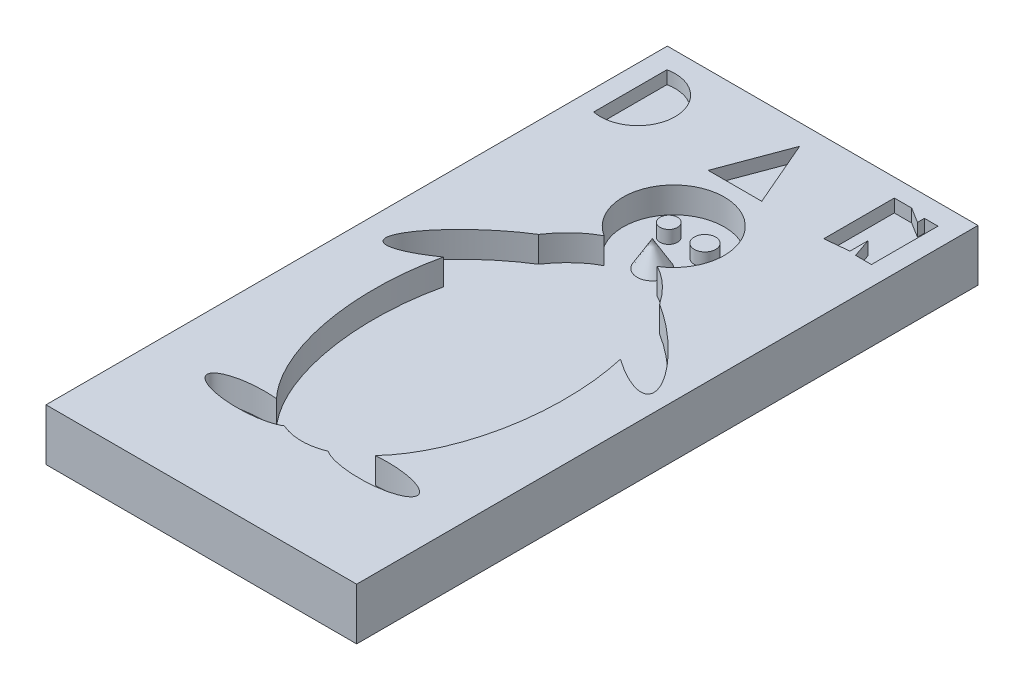
ISO-10303-21;
HEADER;
FILE_DESCRIPTION(('STEP AP214'),'2;1');
FILE_NAME('part.step','',(''),(''),'','','');
FILE_SCHEMA(('AUTOMOTIVE_DESIGN { 1 0 10303 214 1 1 1 1 }'));
ENDSEC;
DATA;
#1=APPLICATION_CONTEXT('core data for automotive mechanical design processes');
#2=APPLICATION_PROTOCOL_DEFINITION('international standard','automotive_design',2000,#1);
#3=PRODUCT_CONTEXT('',#1,'mechanical');
#4=PRODUCT('Part','Part','',(#3));
#5=PRODUCT_RELATED_PRODUCT_CATEGORY('part','',(#4));
#6=PRODUCT_DEFINITION_FORMATION('','',#4);
#7=PRODUCT_DEFINITION_CONTEXT('part definition',#1,'design');
#8=PRODUCT_DEFINITION('design','',#6,#7);
#9=PRODUCT_DEFINITION_SHAPE('','',#8);
#10=(LENGTH_UNIT() NAMED_UNIT(*) SI_UNIT(.MILLI.,.METRE.));
#11=(NAMED_UNIT(*) PLANE_ANGLE_UNIT() SI_UNIT($,.RADIAN.));
#12=(NAMED_UNIT(*) SI_UNIT($,.STERADIAN.) SOLID_ANGLE_UNIT());
#13=UNCERTAINTY_MEASURE_WITH_UNIT(LENGTH_MEASURE(1.E-05),#10,'distance_accuracy_value','');
#14=(GEOMETRIC_REPRESENTATION_CONTEXT(3) GLOBAL_UNCERTAINTY_ASSIGNED_CONTEXT((#13)) GLOBAL_UNIT_ASSIGNED_CONTEXT((#10,
#11,#12)) REPRESENTATION_CONTEXT('',''));
#15=CARTESIAN_POINT('',(0.,0.,0.));
#16=DIRECTION('',(0.,0.,1.));
#17=DIRECTION('',(1.,0.,0.));
#18=AXIS2_PLACEMENT_3D('',#15,#16,#17);
#19=CARTESIAN_POINT('',(0.,12.7,0.));
#20=DIRECTION('',(1.,0.,0.));
#21=DIRECTION('',(0.,0.,-1.));
#22=AXIS2_PLACEMENT_3D('',#19,#20,#21);
#23=PLANE('',#22);
#24=DIRECTION('',(0.,0.,1.));
#25=VECTOR('',#24,1.);
#26=CARTESIAN_POINT('',(0.,0.,0.));
#27=LINE('',#26,#25);
#28=CARTESIAN_POINT('',(0.,0.,-152.4));
#29=VERTEX_POINT('',#28);
#30=CARTESIAN_POINT('',(0.,0.,0.));
#31=VERTEX_POINT('',#30);
#32=EDGE_CURVE('E451',#29,#31,#27,.T.);
#33=ORIENTED_EDGE('',*,*,#32,.T.);
#34=DIRECTION('',(0.,-1.,0.));
#35=VECTOR('',#34,1.);
#36=CARTESIAN_POINT('',(0.,12.7,0.));
#37=LINE('',#36,#35);
#38=CARTESIAN_POINT('',(0.,12.7,0.));
#39=VERTEX_POINT('',#38);
#40=EDGE_CURVE('E454',#39,#31,#37,.T.);
#41=ORIENTED_EDGE('',*,*,#40,.F.);
#42=DIRECTION('',(0.,0.,1.));
#43=VECTOR('',#42,1.);
#44=CARTESIAN_POINT('',(0.,12.7,0.));
#45=LINE('',#44,#43);
#46=CARTESIAN_POINT('',(0.,12.7,-152.4));
#47=VERTEX_POINT('',#46);
#48=EDGE_CURVE('E645',#47,#39,#45,.T.);
#49=ORIENTED_EDGE('',*,*,#48,.F.);
#50=DIRECTION('',(0.,-1.,0.));
#51=VECTOR('',#50,1.);
#52=CARTESIAN_POINT('',(0.,12.7,-152.4));
#53=LINE('',#52,#51);
#54=EDGE_CURVE('E456',#47,#29,#53,.T.);
#55=ORIENTED_EDGE('',*,*,#54,.T.);
#56=EDGE_LOOP('',(#33,#41,#49,#55));
#57=FACE_BOUND('',#56,.T.);
#58=ADVANCED_FACE('F45',(#57),#23,.F.);
#59=CARTESIAN_POINT('',(0.,12.7,0.));
#60=DIRECTION('',(0.,0.,-1.));
#61=DIRECTION('',(-1.,0.,0.));
#62=AXIS2_PLACEMENT_3D('',#59,#60,#61);
#63=PLANE('',#62);
#64=DIRECTION('',(1.,0.,0.));
#65=VECTOR('',#64,1.);
#66=CARTESIAN_POINT('',(0.,0.,0.));
#67=LINE('',#66,#65);
#68=CARTESIAN_POINT('',(76.2,0.,0.));
#69=VERTEX_POINT('',#68);
#70=EDGE_CURVE('E459',#31,#69,#67,.T.);
#71=ORIENTED_EDGE('',*,*,#70,.T.);
#72=DIRECTION('',(0.,-1.,0.));
#73=VECTOR('',#72,1.);
#74=CARTESIAN_POINT('',(76.2,12.7,0.));
#75=LINE('',#74,#73);
#76=CARTESIAN_POINT('',(76.2,12.7,0.));
#77=VERTEX_POINT('',#76);
#78=EDGE_CURVE('E640',#77,#69,#75,.T.);
#79=ORIENTED_EDGE('',*,*,#78,.F.);
#80=DIRECTION('',(1.,0.,0.));
#81=VECTOR('',#80,1.);
#82=CARTESIAN_POINT('',(0.,12.7,0.));
#83=LINE('',#82,#81);
#84=EDGE_CURVE('E648',#39,#77,#83,.T.);
#85=ORIENTED_EDGE('',*,*,#84,.F.);
#86=ORIENTED_EDGE('',*,*,#40,.T.);
#87=EDGE_LOOP('',(#71,#79,#85,#86));
#88=FACE_BOUND('',#87,.T.);
#89=ADVANCED_FACE('F440',(#88),#63,.F.);
#90=CARTESIAN_POINT('',(76.2,12.7,0.));
#91=DIRECTION('',(-1.,0.,0.));
#92=DIRECTION('',(0.,0.,1.));
#93=AXIS2_PLACEMENT_3D('',#90,#91,#92);
#94=PLANE('',#93);
#95=DIRECTION('',(0.,0.,-1.));
#96=VECTOR('',#95,1.);
#97=CARTESIAN_POINT('',(76.2,0.,0.));
#98=LINE('',#97,#96);
#99=CARTESIAN_POINT('',(76.2,0.,-152.4));
#100=VERTEX_POINT('',#99);
#101=EDGE_CURVE('E463',#69,#100,#98,.T.);
#102=ORIENTED_EDGE('',*,*,#101,.T.);
#103=DIRECTION('',(0.,-1.,0.));
#104=VECTOR('',#103,1.);
#105=CARTESIAN_POINT('',(76.2,12.7,-152.4));
#106=LINE('',#105,#104);
#107=CARTESIAN_POINT('',(76.2,12.7,-152.4));
#108=VERTEX_POINT('',#107);
#109=EDGE_CURVE('E637',#108,#100,#106,.T.);
#110=ORIENTED_EDGE('',*,*,#109,.F.);
#111=DIRECTION('',(0.,0.,-1.));
#112=VECTOR('',#111,1.);
#113=CARTESIAN_POINT('',(76.2,12.7,0.));
#114=LINE('',#113,#112);
#115=EDGE_CURVE('E661',#77,#108,#114,.T.);
#116=ORIENTED_EDGE('',*,*,#115,.F.);
#117=ORIENTED_EDGE('',*,*,#78,.T.);
#118=EDGE_LOOP('',(#102,#110,#116,#117));
#119=FACE_BOUND('',#118,.T.);
#120=ADVANCED_FACE('F445',(#119),#94,.F.);
#121=CARTESIAN_POINT('',(0.,12.7,-152.4));
#122=DIRECTION('',(0.,0.,1.));
#123=DIRECTION('',(1.,0.,0.));
#124=AXIS2_PLACEMENT_3D('',#121,#122,#123);
#125=PLANE('',#124);
#126=DIRECTION('',(-1.,0.,0.));
#127=VECTOR('',#126,1.);
#128=CARTESIAN_POINT('',(0.,0.,-152.4));
#129=LINE('',#128,#127);
#130=EDGE_CURVE('E642',#100,#29,#129,.T.);
#131=ORIENTED_EDGE('',*,*,#130,.T.);
#132=ORIENTED_EDGE('',*,*,#54,.F.);
#133=DIRECTION('',(-1.,0.,0.));
#134=VECTOR('',#133,1.);
#135=CARTESIAN_POINT('',(0.,12.7,-152.4));
#136=LINE('',#135,#134);
#137=EDGE_CURVE('E468',#108,#47,#136,.T.);
#138=ORIENTED_EDGE('',*,*,#137,.F.);
#139=ORIENTED_EDGE('',*,*,#109,.T.);
#140=EDGE_LOOP('',(#131,#132,#138,#139));
#141=FACE_BOUND('',#140,.T.);
#142=ADVANCED_FACE('F622',(#141),#125,.F.);
#143=CARTESIAN_POINT('',(0.,12.7,0.));
#144=DIRECTION('',(0.,-1.,0.));
#145=DIRECTION('',(0.,0.,-1.));
#146=AXIS2_PLACEMENT_3D('',#143,#144,#145);
#147=PLANE('',#146);
#148=DIRECTION('',(0.,0.,-1.));
#149=VECTOR('',#148,1.);
#150=CARTESIAN_POINT('',(65.9497700628187,12.7,-131.229413086132));
#151=LINE('',#150,#149);
#152=CARTESIAN_POINT('',(65.9497700628187,12.7,-131.229413086132));
#153=VERTEX_POINT('',#152);
#154=CARTESIAN_POINT('',(65.9497700628187,12.7,-135.702678285083));
#155=VERTEX_POINT('',#154);
#156=EDGE_CURVE('E327',#153,#155,#151,.T.);
#157=ORIENTED_EDGE('',*,*,#156,.F.);
#158=DIRECTION('',(0.995174203608631,0.,-0.0981239240548751));
#159=VECTOR('',#158,1.);
#160=CARTESIAN_POINT('',(60.1133722269722,12.7,-130.653945739891));
#161=LINE('',#160,#159);
#162=CARTESIAN_POINT('',(60.1133722269722,12.7,-130.653945739891));
#163=VERTEX_POINT('',#162);
#164=EDGE_CURVE('E60',#163,#153,#161,.T.);
#165=ORIENTED_EDGE('',*,*,#164,.F.);
#166=DIRECTION('',(0.,0.,1.));
#167=VECTOR('',#166,1.);
#168=CARTESIAN_POINT('',(60.1133722269722,12.7,-147.960052905901));
#169=LINE('',#168,#167);
#170=CARTESIAN_POINT('',(60.1133722269722,12.7,-147.960052905901));
#171=VERTEX_POINT('',#170);
#172=EDGE_CURVE('E262',#171,#163,#169,.T.);
#173=ORIENTED_EDGE('',*,*,#172,.F.);
#174=DIRECTION('',(-1.,0.,0.));
#175=VECTOR('',#174,1.);
#176=CARTESIAN_POINT('',(64.3688834252405,12.7,-147.960052905901));
#177=LINE('',#176,#175);
#178=CARTESIAN_POINT('',(64.3688834252405,12.7,-147.960052905901));
#179=VERTEX_POINT('',#178);
#180=EDGE_CURVE('E266',#179,#171,#177,.T.);
#181=ORIENTED_EDGE('',*,*,#180,.F.);
#182=DIRECTION('',(-0.850478806426206,0.,-0.526009315335628));
#183=VECTOR('',#182,1.);
#184=CARTESIAN_POINT('',(66.9668400143631,12.7,-146.353252881738));
#185=LINE('',#184,#183);
#186=CARTESIAN_POINT('',(68.1167415018899,12.7,-145.642054801801));
#187=VERTEX_POINT('',#186);
#188=EDGE_CURVE('E356',#187,#179,#185,.T.);
#189=ORIENTED_EDGE('',*,*,#188,.F.);
#190=DIRECTION('',(0.,0.,1.));
#191=VECTOR('',#190,1.);
#192=CARTESIAN_POINT('',(68.1167415018899,12.7,-147.337843697603));
#193=LINE('',#192,#191);
#194=CARTESIAN_POINT('',(68.1167415018899,12.7,-147.337843697603));
#195=VERTEX_POINT('',#194);
#196=EDGE_CURVE('E353',#195,#187,#193,.T.);
#197=ORIENTED_EDGE('',*,*,#196,.F.);
#198=DIRECTION('',(-1.,0.,0.));
#199=VECTOR('',#198,1.);
#200=CARTESIAN_POINT('',(71.4413893375623,12.7,-147.337843697603));
#201=LINE('',#200,#199);
#202=CARTESIAN_POINT('',(71.4413893375623,12.7,-147.337843697603));
#203=VERTEX_POINT('',#202);
#204=EDGE_CURVE('E348',#203,#195,#201,.T.);
#205=ORIENTED_EDGE('',*,*,#204,.F.);
#206=DIRECTION('',(0.,0.,-1.));
#207=VECTOR('',#206,1.);
#208=CARTESIAN_POINT('',(71.4413893375623,12.7,-131.0087177459));
#209=LINE('',#208,#207);
#210=CARTESIAN_POINT('',(71.4413893375623,12.7,-131.0087177459));
#211=VERTEX_POINT('',#210);
#212=EDGE_CURVE('E343',#211,#203,#209,.T.);
#213=ORIENTED_EDGE('',*,*,#212,.F.);
#214=DIRECTION('',(0.999984768563022,0.,0.00551929723421201));
#215=VECTOR('',#214,1.);
#216=CARTESIAN_POINT('',(67.5417907581265,12.7,-131.030241117386));
#217=LINE('',#216,#215);
#218=CARTESIAN_POINT('',(67.5417907581265,12.7,-131.030241117386));
#219=VERTEX_POINT('',#218);
#220=EDGE_CURVE('E339',#219,#211,#217,.T.);
#221=ORIENTED_EDGE('',*,*,#220,.F.);
#222=DIRECTION('',(0.322518637021301,0.,0.946563113993949));
#223=VECTOR('',#222,1.);
#224=CARTESIAN_POINT('',(65.9497700628187,12.7,-135.702678285083));
#225=LINE('',#224,#223);
#226=EDGE_CURVE('E331',#155,#219,#225,.T.);
#227=ORIENTED_EDGE('',*,*,#226,.F.);
#228=EDGE_LOOP('',(#157,#165,#173,#181,#189,#197,#205,#213,#221,#227));
#229=FACE_BOUND('',#228,.T.);
#230=DIRECTION('',(1.,0.,0.));
#231=VECTOR('',#230,1.);
#232=CARTESIAN_POINT('',(44.550696836223,12.7,-131.0087177459));
#233=LINE('',#232,#231);
#234=CARTESIAN_POINT('',(31.415995895903,12.7,-131.0087177459));
#235=VERTEX_POINT('',#234);
#236=CARTESIAN_POINT('',(44.550696836223,12.7,-131.0087177459));
#237=VERTEX_POINT('',#236);
#238=EDGE_CURVE('E286',#235,#237,#233,.T.);
#239=ORIENTED_EDGE('',*,*,#238,.F.);
#240=DIRECTION('',(-0.349907294155298,0.,0.936784332435656));
#241=VECTOR('',#240,1.);
#242=CARTESIAN_POINT('',(31.415995895903,12.7,-131.0087177459));
#243=LINE('',#242,#241);
#244=CARTESIAN_POINT('',(37.5152442285751,12.7,-147.337843697603));
#245=VERTEX_POINT('',#244);
#246=EDGE_CURVE('E68',#245,#235,#243,.T.);
#247=ORIENTED_EDGE('',*,*,#246,.F.);
#248=DIRECTION('',(-0.39568877206628,0.,-0.918384666499109));
#249=VECTOR('',#248,1.);
#250=CARTESIAN_POINT('',(37.5152442285751,12.7,-147.337843697603));
#251=LINE('',#250,#249);
#252=EDGE_CURVE('E681',#237,#245,#251,.T.);
#253=ORIENTED_EDGE('',*,*,#252,.F.);
#254=EDGE_LOOP('',(#239,#247,#253));
#255=FACE_BOUND('',#254,.T.);
#256=DIRECTION('',(0.,0.,1.));
#257=VECTOR('',#256,1.);
#258=CARTESIAN_POINT('',(4.97514907709816,12.7,-147.330196680866));
#259=LINE('',#258,#257);
#260=CARTESIAN_POINT('',(4.97514907709816,12.7,-147.330196680866));
#261=VERTEX_POINT('',#260);
#262=CARTESIAN_POINT('',(4.97514907709816,12.7,-129.360621000327));
#263=VERTEX_POINT('',#262);
#264=EDGE_CURVE('E739',#261,#263,#259,.T.);
#265=ORIENTED_EDGE('',*,*,#264,.F.);
#266=CARTESIAN_POINT('',(6.79736608333222,12.7,-138.345408840596));
#267=DIRECTION('',(0.,1.,0.));
#268=DIRECTION('',(0.,0.,1.));
#269=AXIS2_PLACEMENT_3D('',#266,#267,#268);
#270=CIRCLE('',#269,9.16770894784867);
#271=EDGE_CURVE('E725',#263,#261,#270,.T.);
#272=ORIENTED_EDGE('',*,*,#271,.F.);
#273=EDGE_LOOP('',(#265,#272));
#274=FACE_BOUND('',#273,.T.);
#275=CARTESIAN_POINT('',(39.0545532297307,12.7,-64.8050208200895));
#276=DIRECTION('',(0.,1.,0.));
#277=DIRECTION('',(0.,0.,-1.));
#278=AXIS2_PLACEMENT_3D('',#275,#276,#277);
#279=ELLIPSE('',#278,41.1651080321378,23.3865541284029);
#280=CARTESIAN_POINT('',(51.1704601228422,12.7,-29.5949675785346));
#281=VERTEX_POINT('',#280);
#282=CARTESIAN_POINT('',(60.7614639489399,12.7,-80.1239487168077));
#283=VERTEX_POINT('',#282);
#284=EDGE_CURVE('E818',#281,#283,#279,.T.);
#285=ORIENTED_EDGE('',*,*,#284,.F.);
#286=CARTESIAN_POINT('',(54.0887665979898,12.7,-26.2649341697113));
#287=DIRECTION('',(0.,1.,0.));
#288=DIRECTION('',(1.,0.,0.));
#289=AXIS2_PLACEMENT_3D('',#286,#287,#288);
#290=ELLIPSE('',#289,10.7387238344707,3.4602554577739);
#291=CARTESIAN_POINT('',(44.4397615741793,12.7,-24.7461462403595));
#292=VERTEX_POINT('',#291);
#293=EDGE_CURVE('E531',#292,#281,#290,.T.);
#294=ORIENTED_EDGE('',*,*,#293,.F.);
#295=CARTESIAN_POINT('',(39.0545532297307,12.7,-64.8050208200895));
#296=DIRECTION('',(0.,1.,0.));
#297=DIRECTION('',(0.,0.,-1.));
#298=AXIS2_PLACEMENT_3D('',#295,#296,#297);
#299=ELLIPSE('',#298,41.1651080321378,23.3865541284029);
#300=CARTESIAN_POINT('',(33.6693448852822,12.7,-24.7461462403595));
#301=VERTEX_POINT('',#300);
#302=EDGE_CURVE('E868',#301,#292,#299,.T.);
#303=ORIENTED_EDGE('',*,*,#302,.F.);
#304=CARTESIAN_POINT('',(24.0203398614717,12.7,-26.2649341697113));
#305=DIRECTION('',(0.,1.,0.));
#306=DIRECTION('',(-1.,0.,0.));
#307=AXIS2_PLACEMENT_3D('',#304,#305,#306);
#308=ELLIPSE('',#307,10.7387238344707,3.4602554577739);
#309=CARTESIAN_POINT('',(26.9386463366192,12.7,-29.5949675785347));
#310=VERTEX_POINT('',#309);
#311=EDGE_CURVE('E864',#310,#301,#308,.T.);
#312=ORIENTED_EDGE('',*,*,#311,.F.);
#313=CARTESIAN_POINT('',(39.0545532297307,12.7,-64.8050208200895));
#314=DIRECTION('',(0.,1.,0.));
#315=DIRECTION('',(0.,0.,-1.));
#316=AXIS2_PLACEMENT_3D('',#313,#314,#315);
#317=ELLIPSE('',#316,41.1651080321378,23.3865541284029);
#318=CARTESIAN_POINT('',(17.3476425105216,12.7,-80.1239487168077));
#319=VERTEX_POINT('',#318);
#320=EDGE_CURVE('E859',#319,#310,#317,.T.);
#321=ORIENTED_EDGE('',*,*,#320,.F.);
#322=CARTESIAN_POINT('',(19.5674423961929,12.7,-87.5643592216893));
#323=DIRECTION('',(0.,1.,0.));
#324=DIRECTION('',(-0.753154463756515,0.,0.657843715272584));
#325=AXIS2_PLACEMENT_3D('',#322,#323,#324);
#326=ELLIPSE('',#325,17.3479068671643,4.47658007025889);
#327=CARTESIAN_POINT('',(24.1993099438547,12.7,-96.5986463652632));
#328=VERTEX_POINT('',#327);
#329=EDGE_CURVE('E854',#328,#319,#326,.T.);
#330=ORIENTED_EDGE('',*,*,#329,.F.);
#331=CARTESIAN_POINT('',(39.0545532297307,12.7,-64.8050208200895));
#332=DIRECTION('',(0.,1.,0.));
#333=DIRECTION('',(0.,0.,-1.));
#334=AXIS2_PLACEMENT_3D('',#331,#332,#333);
#335=ELLIPSE('',#334,41.1651080321378,23.3865541284029);
#336=CARTESIAN_POINT('',(32.5547794778824,12.7,-104.348304437076));
#337=VERTEX_POINT('',#336);
#338=EDGE_CURVE('E850',#337,#328,#335,.T.);
#339=ORIENTED_EDGE('',*,*,#338,.F.);
#340=CARTESIAN_POINT('',(39.0545532297307,12.7,-114.919065380953));
#341=DIRECTION('',(0.,1.,0.));
#342=DIRECTION('',(0.,0.,1.));
#343=AXIS2_PLACEMENT_3D('',#340,#341,#342);
#344=CIRCLE('',#343,12.4091919864995);
#345=CARTESIAN_POINT('',(45.5543269815791,12.7,-104.348304437076));
#346=VERTEX_POINT('',#345);
#347=EDGE_CURVE('E842',#346,#337,#344,.T.);
#348=ORIENTED_EDGE('',*,*,#347,.F.);
#349=CARTESIAN_POINT('',(39.0545532297307,12.7,-64.8050208200895));
#350=DIRECTION('',(0.,1.,0.));
#351=DIRECTION('',(0.,0.,-1.));
#352=AXIS2_PLACEMENT_3D('',#349,#350,#351);
#353=ELLIPSE('',#352,41.1651080321378,23.3865541284029);
#354=CARTESIAN_POINT('',(53.9097965156068,12.7,-96.5986463652632));
#355=VERTEX_POINT('',#354);
#356=EDGE_CURVE('E837',#355,#346,#353,.T.);
#357=ORIENTED_EDGE('',*,*,#356,.F.);
#358=CARTESIAN_POINT('',(58.5416640632686,12.7,-87.5643592216893));
#359=DIRECTION('',(0.,1.,0.));
#360=DIRECTION('',(0.753154463756515,0.,0.657843715272584));
#361=AXIS2_PLACEMENT_3D('',#358,#359,#360);
#362=ELLIPSE('',#361,17.3479068671643,4.47658007025889);
#363=EDGE_CURVE('E832',#283,#355,#362,.T.);
#364=ORIENTED_EDGE('',*,*,#363,.F.);
#365=EDGE_LOOP('',(#285,#294,#303,#312,#321,#330,#339,#348,#357,#364));
#366=FACE_BOUND('',#365,.T.);
#367=ORIENTED_EDGE('',*,*,#48,.T.);
#368=ORIENTED_EDGE('',*,*,#84,.T.);
#369=ORIENTED_EDGE('',*,*,#115,.T.);
#370=ORIENTED_EDGE('',*,*,#137,.T.);
#371=EDGE_LOOP('',(#367,#368,#369,#370));
#372=FACE_BOUND('',#371,.T.);
#373=ADVANCED_FACE('F375',(#229,#255,#274,#366,#372),#147,.F.);
#374=CARTESIAN_POINT('',(0.,0.,0.));
#375=DIRECTION('',(0.,-1.,0.));
#376=DIRECTION('',(0.,0.,-1.));
#377=AXIS2_PLACEMENT_3D('',#374,#375,#376);
#378=PLANE('',#377);
#379=ORIENTED_EDGE('',*,*,#32,.F.);
#380=ORIENTED_EDGE('',*,*,#130,.F.);
#381=ORIENTED_EDGE('',*,*,#101,.F.);
#382=ORIENTED_EDGE('',*,*,#70,.F.);
#383=EDGE_LOOP('',(#379,#380,#381,#382));
#384=FACE_BOUND('',#383,.T.);
#385=ADVANCED_FACE('F618',(#384),#378,.T.);
#386=CARTESIAN_POINT('',(54.0887665979898,6.35,-26.2649341697113));
#387=DIRECTION('',(0.,1.,0.));
#388=DIRECTION('',(1.,0.,0.));
#389=AXIS2_PLACEMENT_3D('',#386,#387,#388);
#390=ELLIPSE('',#389,10.7387238344707,3.4602554577739);
#391=DIRECTION('',(0.,1.,0.));
#392=VECTOR('',#391,1.);
#393=SURFACE_OF_LINEAR_EXTRUSION('',#390,#392);
#394=ORIENTED_EDGE('',*,*,#293,.T.);
#395=DIRECTION('',(0.,1.,0.));
#396=VECTOR('',#395,1.);
#397=CARTESIAN_POINT('',(51.1704601228422,6.35,-29.5949675785346));
#398=LINE('',#397,#396);
#399=CARTESIAN_POINT('',(51.1704601228422,6.35,-29.5949675785346));
#400=VERTEX_POINT('',#399);
#401=EDGE_CURVE('E514',#400,#281,#398,.T.);
#402=ORIENTED_EDGE('',*,*,#401,.F.);
#403=CARTESIAN_POINT('',(44.4397615741793,6.35,-24.7461462403595));
#404=VERTEX_POINT('',#403);
#405=EDGE_CURVE('E608',#404,#400,#390,.T.);
#406=ORIENTED_EDGE('',*,*,#405,.F.);
#407=DIRECTION('',(0.,1.,0.));
#408=VECTOR('',#407,1.);
#409=CARTESIAN_POINT('',(44.4397615741793,6.35,-24.7461462403595));
#410=LINE('',#409,#408);
#411=EDGE_CURVE('E460',#404,#292,#410,.T.);
#412=ORIENTED_EDGE('',*,*,#411,.T.);
#413=EDGE_LOOP('',(#394,#402,#406,#412));
#414=FACE_BOUND('',#413,.T.);
#415=ADVANCED_FACE('F541',(#414),#393,.F.);
#416=CARTESIAN_POINT('',(39.0545532297307,6.35,-64.8050208200895));
#417=DIRECTION('',(0.,1.,0.));
#418=DIRECTION('',(0.,0.,-1.));
#419=AXIS2_PLACEMENT_3D('',#416,#417,#418);
#420=ELLIPSE('',#419,41.1651080321378,23.3865541284029);
#421=DIRECTION('',(0.,1.,0.));
#422=VECTOR('',#421,1.);
#423=SURFACE_OF_LINEAR_EXTRUSION('',#420,#422);
#424=ORIENTED_EDGE('',*,*,#302,.T.);
#425=ORIENTED_EDGE('',*,*,#411,.F.);
#426=CARTESIAN_POINT('',(33.6693448852822,6.35,-24.7461462403595));
#427=VERTEX_POINT('',#426);
#428=EDGE_CURVE('E523',#427,#404,#420,.T.);
#429=ORIENTED_EDGE('',*,*,#428,.F.);
#430=DIRECTION('',(0.,1.,0.));
#431=VECTOR('',#430,1.);
#432=CARTESIAN_POINT('',(33.6693448852822,6.35,-24.7461462403595));
#433=LINE('',#432,#431);
#434=EDGE_CURVE('E465',#427,#301,#433,.T.);
#435=ORIENTED_EDGE('',*,*,#434,.T.);
#436=EDGE_LOOP('',(#424,#425,#429,#435));
#437=FACE_BOUND('',#436,.T.);
#438=ADVANCED_FACE('F536',(#437),#423,.F.);
#439=CARTESIAN_POINT('',(24.0203398614717,6.35,-26.2649341697113));
#440=DIRECTION('',(0.,1.,0.));
#441=DIRECTION('',(-1.,0.,0.));
#442=AXIS2_PLACEMENT_3D('',#439,#440,#441);
#443=ELLIPSE('',#442,10.7387238344707,3.4602554577739);
#444=DIRECTION('',(0.,1.,0.));
#445=VECTOR('',#444,1.);
#446=SURFACE_OF_LINEAR_EXTRUSION('',#443,#445);
#447=ORIENTED_EDGE('',*,*,#311,.T.);
#448=ORIENTED_EDGE('',*,*,#434,.F.);
#449=CARTESIAN_POINT('',(26.9386463366192,6.35,-29.5949675785347));
#450=VERTEX_POINT('',#449);
#451=EDGE_CURVE('E528',#450,#427,#443,.T.);
#452=ORIENTED_EDGE('',*,*,#451,.F.);
#453=DIRECTION('',(0.,1.,0.));
#454=VECTOR('',#453,1.);
#455=CARTESIAN_POINT('',(26.9386463366192,6.35,-29.5949675785347));
#456=LINE('',#455,#454);
#457=EDGE_CURVE('E483',#450,#310,#456,.T.);
#458=ORIENTED_EDGE('',*,*,#457,.T.);
#459=EDGE_LOOP('',(#447,#448,#452,#458));
#460=FACE_BOUND('',#459,.T.);
#461=ADVANCED_FACE('F540',(#460),#446,.F.);
#462=CARTESIAN_POINT('',(39.0545532297307,6.35,-64.8050208200895));
#463=DIRECTION('',(0.,1.,0.));
#464=DIRECTION('',(0.,0.,-1.));
#465=AXIS2_PLACEMENT_3D('',#462,#463,#464);
#466=ELLIPSE('',#465,41.1651080321378,23.3865541284029);
#467=DIRECTION('',(0.,1.,0.));
#468=VECTOR('',#467,1.);
#469=SURFACE_OF_LINEAR_EXTRUSION('',#466,#468);
#470=ORIENTED_EDGE('',*,*,#320,.T.);
#471=ORIENTED_EDGE('',*,*,#457,.F.);
#472=CARTESIAN_POINT('',(17.3476425105216,6.35,-80.1239487168077));
#473=VERTEX_POINT('',#472);
#474=EDGE_CURVE('E555',#473,#450,#466,.T.);
#475=ORIENTED_EDGE('',*,*,#474,.F.);
#476=DIRECTION('',(0.,1.,0.));
#477=VECTOR('',#476,1.);
#478=CARTESIAN_POINT('',(17.3476425105216,6.35,-80.1239487168077));
#479=LINE('',#478,#477);
#480=EDGE_CURVE('E487',#473,#319,#479,.T.);
#481=ORIENTED_EDGE('',*,*,#480,.T.);
#482=EDGE_LOOP('',(#470,#471,#475,#481));
#483=FACE_BOUND('',#482,.T.);
#484=ADVANCED_FACE('F547',(#483),#469,.F.);
#485=CARTESIAN_POINT('',(19.5674423961929,6.35,-87.5643592216893));
#486=DIRECTION('',(0.,1.,0.));
#487=DIRECTION('',(-0.753154463756515,0.,0.657843715272584));
#488=AXIS2_PLACEMENT_3D('',#485,#486,#487);
#489=ELLIPSE('',#488,17.3479068671643,4.47658007025889);
#490=DIRECTION('',(0.,1.,0.));
#491=VECTOR('',#490,1.);
#492=SURFACE_OF_LINEAR_EXTRUSION('',#489,#491);
#493=ORIENTED_EDGE('',*,*,#329,.T.);
#494=ORIENTED_EDGE('',*,*,#480,.F.);
#495=CARTESIAN_POINT('',(24.1993099438547,6.35,-96.5986463652632));
#496=VERTEX_POINT('',#495);
#497=EDGE_CURVE('E559',#496,#473,#489,.T.);
#498=ORIENTED_EDGE('',*,*,#497,.F.);
#499=DIRECTION('',(0.,1.,0.));
#500=VECTOR('',#499,1.);
#501=CARTESIAN_POINT('',(24.1993099438547,6.35,-96.5986463652632));
#502=LINE('',#501,#500);
#503=EDGE_CURVE('E491',#496,#328,#502,.T.);
#504=ORIENTED_EDGE('',*,*,#503,.T.);
#505=EDGE_LOOP('',(#493,#494,#498,#504));
#506=FACE_BOUND('',#505,.T.);
#507=ADVANCED_FACE('F551',(#506),#492,.F.);
#508=CARTESIAN_POINT('',(39.0545532297307,6.35,-64.8050208200895));
#509=DIRECTION('',(0.,1.,0.));
#510=DIRECTION('',(0.,0.,-1.));
#511=AXIS2_PLACEMENT_3D('',#508,#509,#510);
#512=ELLIPSE('',#511,41.1651080321378,23.3865541284029);
#513=DIRECTION('',(0.,1.,0.));
#514=VECTOR('',#513,1.);
#515=SURFACE_OF_LINEAR_EXTRUSION('',#512,#514);
#516=ORIENTED_EDGE('',*,*,#338,.T.);
#517=ORIENTED_EDGE('',*,*,#503,.F.);
#518=CARTESIAN_POINT('',(32.5547794778824,6.35,-104.348304437076));
#519=VERTEX_POINT('',#518);
#520=EDGE_CURVE('E568',#519,#496,#512,.T.);
#521=ORIENTED_EDGE('',*,*,#520,.F.);
#522=DIRECTION('',(0.,1.,0.));
#523=VECTOR('',#522,1.);
#524=CARTESIAN_POINT('',(32.5547794778824,6.35,-104.348304437076));
#525=LINE('',#524,#523);
#526=EDGE_CURVE('E495',#519,#337,#525,.T.);
#527=ORIENTED_EDGE('',*,*,#526,.T.);
#528=EDGE_LOOP('',(#516,#517,#521,#527));
#529=FACE_BOUND('',#528,.T.);
#530=ADVANCED_FACE('F576',(#529),#515,.F.);
#531=CARTESIAN_POINT('',(39.0545532297307,6.35,-114.919065380953));
#532=DIRECTION('',(0.,1.,0.));
#533=DIRECTION('',(0.,0.,1.));
#534=AXIS2_PLACEMENT_3D('',#531,#532,#533);
#535=CYLINDRICAL_SURFACE('',#534,12.4091919864995);
#536=ORIENTED_EDGE('',*,*,#347,.T.);
#537=ORIENTED_EDGE('',*,*,#526,.F.);
#538=CARTESIAN_POINT('',(39.0545532297307,6.35,-114.919065380953));
#539=DIRECTION('',(0.,1.,0.));
#540=DIRECTION('',(0.,0.,1.));
#541=AXIS2_PLACEMENT_3D('',#538,#539,#540);
#542=CIRCLE('',#541,12.4091919864995);
#543=CARTESIAN_POINT('',(45.5543269815791,6.35,-104.348304437076));
#544=VERTEX_POINT('',#543);
#545=EDGE_CURVE('E572',#544,#519,#542,.T.);
#546=ORIENTED_EDGE('',*,*,#545,.F.);
#547=DIRECTION('',(0.,1.,0.));
#548=VECTOR('',#547,1.);
#549=CARTESIAN_POINT('',(45.5543269815791,6.35,-104.348304437076));
#550=LINE('',#549,#548);
#551=EDGE_CURVE('E503',#544,#346,#550,.T.);
#552=ORIENTED_EDGE('',*,*,#551,.T.);
#553=EDGE_LOOP('',(#536,#537,#546,#552));
#554=FACE_BOUND('',#553,.T.);
#555=ADVANCED_FACE('F579',(#554),#535,.F.);
#556=CARTESIAN_POINT('',(39.0545532297307,6.35,-64.8050208200895));
#557=DIRECTION('',(0.,1.,0.));
#558=DIRECTION('',(0.,0.,-1.));
#559=AXIS2_PLACEMENT_3D('',#556,#557,#558);
#560=ELLIPSE('',#559,41.1651080321378,23.3865541284029);
#561=DIRECTION('',(0.,1.,0.));
#562=VECTOR('',#561,1.);
#563=SURFACE_OF_LINEAR_EXTRUSION('',#560,#562);
#564=ORIENTED_EDGE('',*,*,#356,.T.);
#565=ORIENTED_EDGE('',*,*,#551,.F.);
#566=CARTESIAN_POINT('',(53.9097965156068,6.35,-96.5986463652632));
#567=VERTEX_POINT('',#566);
#568=EDGE_CURVE('E591',#567,#544,#560,.T.);
#569=ORIENTED_EDGE('',*,*,#568,.F.);
#570=DIRECTION('',(0.,1.,0.));
#571=VECTOR('',#570,1.);
#572=CARTESIAN_POINT('',(53.9097965156068,6.35,-96.5986463652632));
#573=LINE('',#572,#571);
#574=EDGE_CURVE('E506',#567,#355,#573,.T.);
#575=ORIENTED_EDGE('',*,*,#574,.T.);
#576=EDGE_LOOP('',(#564,#565,#569,#575));
#577=FACE_BOUND('',#576,.T.);
#578=ADVANCED_FACE('F583',(#577),#563,.F.);
#579=CARTESIAN_POINT('',(58.5416640632686,6.35,-87.5643592216893));
#580=DIRECTION('',(0.,1.,0.));
#581=DIRECTION('',(0.753154463756515,0.,0.657843715272584));
#582=AXIS2_PLACEMENT_3D('',#579,#580,#581);
#583=ELLIPSE('',#582,17.3479068671643,4.47658007025889);
#584=DIRECTION('',(0.,1.,0.));
#585=VECTOR('',#584,1.);
#586=SURFACE_OF_LINEAR_EXTRUSION('',#583,#585);
#587=ORIENTED_EDGE('',*,*,#363,.T.);
#588=ORIENTED_EDGE('',*,*,#574,.F.);
#589=CARTESIAN_POINT('',(60.7614639489399,6.35,-80.1239487168077));
#590=VERTEX_POINT('',#589);
#591=EDGE_CURVE('E595',#590,#567,#583,.T.);
#592=ORIENTED_EDGE('',*,*,#591,.F.);
#593=DIRECTION('',(0.,1.,0.));
#594=VECTOR('',#593,1.);
#595=CARTESIAN_POINT('',(60.7614639489399,6.35,-80.1239487168077));
#596=LINE('',#595,#594);
#597=EDGE_CURVE('E510',#590,#283,#596,.T.);
#598=ORIENTED_EDGE('',*,*,#597,.T.);
#599=EDGE_LOOP('',(#587,#588,#592,#598));
#600=FACE_BOUND('',#599,.T.);
#601=ADVANCED_FACE('F587',(#600),#586,.F.);
#602=CARTESIAN_POINT('',(39.0545532297307,6.35,-64.8050208200895));
#603=DIRECTION('',(0.,1.,0.));
#604=DIRECTION('',(0.,0.,-1.));
#605=AXIS2_PLACEMENT_3D('',#602,#603,#604);
#606=ELLIPSE('',#605,41.1651080321378,23.3865541284029);
#607=DIRECTION('',(0.,1.,0.));
#608=VECTOR('',#607,1.);
#609=SURFACE_OF_LINEAR_EXTRUSION('',#606,#608);
#610=ORIENTED_EDGE('',*,*,#284,.T.);
#611=ORIENTED_EDGE('',*,*,#597,.F.);
#612=EDGE_CURVE('E604',#400,#590,#606,.T.);
#613=ORIENTED_EDGE('',*,*,#612,.F.);
#614=ORIENTED_EDGE('',*,*,#401,.T.);
#615=EDGE_LOOP('',(#610,#611,#613,#614));
#616=FACE_BOUND('',#615,.T.);
#617=ADVANCED_FACE('F612',(#616),#609,.F.);
#618=CARTESIAN_POINT('',(54.0887665979898,6.35,-26.2649341697113));
#619=DIRECTION('',(0.,-1.,0.));
#620=DIRECTION('',(0.,0.,-1.));
#621=AXIS2_PLACEMENT_3D('',#618,#619,#620);
#622=PLANE('',#621);
#623=CARTESIAN_POINT('',(43.3131818208311,6.35,-118.313867451034));
#624=DIRECTION('',(0.,-1.,0.));
#625=DIRECTION('',(0.,0.,-1.));
#626=AXIS2_PLACEMENT_3D('',#623,#624,#625);
#627=CIRCLE('',#626,2.6250213817595);
#628=CARTESIAN_POINT('',(43.3131818208311,6.35,-120.938888832794));
#629=VERTEX_POINT('',#628);
#630=EDGE_CURVE('E13',#629,#629,#627,.F.);
#631=ORIENTED_EDGE('',*,*,#630,.F.);
#632=EDGE_LOOP('',(#631));
#633=FACE_BOUND('',#632,.T.);
#634=CARTESIAN_POINT('',(34.4451334713621,6.35,-118.313867451034));
#635=DIRECTION('',(0.,-1.,0.));
#636=DIRECTION('',(0.,0.,-1.));
#637=AXIS2_PLACEMENT_3D('',#634,#635,#636);
#638=CIRCLE('',#637,2.14774476689414);
#639=CARTESIAN_POINT('',(34.4451334713621,6.35,-120.461612217929));
#640=VERTEX_POINT('',#639);
#641=EDGE_CURVE('E53',#640,#640,#638,.F.);
#642=ORIENTED_EDGE('',*,*,#641,.F.);
#643=EDGE_LOOP('',(#642));
#644=FACE_BOUND('',#643,.T.);
#645=CARTESIAN_POINT('',(39.0545532297307,6.35,-109.669022617434));
#646=DIRECTION('',(0.,1.,0.));
#647=DIRECTION('',(0.,0.,1.));
#648=AXIS2_PLACEMENT_3D('',#645,#646,#647);
#649=CIRCLE('',#648,3.74479699542312);
#650=CARTESIAN_POINT('',(39.0545532297307,6.35,-105.924225622011));
#651=VERTEX_POINT('',#650);
#652=EDGE_CURVE('E812',#651,#651,#649,.T.);
#653=ORIENTED_EDGE('',*,*,#652,.F.);
#654=EDGE_LOOP('',(#653));
#655=FACE_BOUND('',#654,.T.);
#656=ORIENTED_EDGE('',*,*,#405,.T.);
#657=ORIENTED_EDGE('',*,*,#612,.T.);
#658=ORIENTED_EDGE('',*,*,#591,.T.);
#659=ORIENTED_EDGE('',*,*,#568,.T.);
#660=ORIENTED_EDGE('',*,*,#545,.T.);
#661=ORIENTED_EDGE('',*,*,#520,.T.);
#662=ORIENTED_EDGE('',*,*,#497,.T.);
#663=ORIENTED_EDGE('',*,*,#474,.T.);
#664=ORIENTED_EDGE('',*,*,#451,.T.);
#665=ORIENTED_EDGE('',*,*,#428,.T.);
#666=EDGE_LOOP('',(#656,#657,#658,#659,#660,#661,#662,#663,#664,#665));
#667=FACE_BOUND('',#666,.T.);
#668=ADVANCED_FACE('F543',(#633,#644,#655,#667),#622,.F.);
#669=CARTESIAN_POINT('',(39.0545532297307,12.7,-109.669022617434));
#670=DIRECTION('',(0.,-1.,0.));
#671=DIRECTION('',(0.,0.,-1.));
#672=AXIS2_PLACEMENT_3D('',#669,#670,#671);
#673=CONICAL_SURFACE('',#672,0.,0.532835147803922);
#674=ORIENTED_EDGE('',*,*,#652,.T.);
#675=EDGE_LOOP('',(#674));
#676=FACE_BOUND('',#675,.T.);
#677=CARTESIAN_POINT('',(39.0545532297307,12.7,-109.669022617434));
#678=VERTEX_POINT('',#677);
#679=VERTEX_LOOP('',#678);
#680=FACE_BOUND('',#679,.T.);
#681=ADVANCED_FACE('F801',(#676,#680),#673,.T.);
#682=CARTESIAN_POINT('',(34.4451334713621,9.525,-118.313867451034));
#683=DIRECTION('',(0.,-1.,0.));
#684=DIRECTION('',(0.,0.,-1.));
#685=AXIS2_PLACEMENT_3D('',#682,#683,#684);
#686=CYLINDRICAL_SURFACE('',#685,2.14774476689414);
#687=CARTESIAN_POINT('',(34.4451334713621,9.525,-118.313867451034));
#688=DIRECTION('',(0.,1.,0.));
#689=DIRECTION('',(0.,0.,1.));
#690=AXIS2_PLACEMENT_3D('',#687,#688,#689);
#691=CIRCLE('',#690,2.14774476689414);
#692=CARTESIAN_POINT('',(34.4451334713621,9.525,-116.16612268414));
#693=VERTEX_POINT('',#692);
#694=EDGE_CURVE('E815',#693,#693,#691,.T.);
#695=ORIENTED_EDGE('',*,*,#694,.F.);
#696=EDGE_LOOP('',(#695));
#697=FACE_BOUND('',#696,.T.);
#698=ORIENTED_EDGE('',*,*,#641,.T.);
#699=EDGE_LOOP('',(#698));
#700=FACE_BOUND('',#699,.T.);
#701=ADVANCED_FACE('F798',(#697,#700),#686,.T.);
#702=CARTESIAN_POINT('',(34.4451334713621,9.525,-118.313867451034));
#703=DIRECTION('',(0.,1.,0.));
#704=DIRECTION('',(0.,0.,1.));
#705=AXIS2_PLACEMENT_3D('',#702,#703,#704);
#706=PLANE('',#705);
#707=ORIENTED_EDGE('',*,*,#694,.T.);
#708=EDGE_LOOP('',(#707));
#709=FACE_BOUND('',#708,.T.);
#710=ADVANCED_FACE('F794',(#709),#706,.T.);
#711=CARTESIAN_POINT('',(43.3131818208311,9.525,-118.313867451034));
#712=DIRECTION('',(0.,-1.,0.));
#713=DIRECTION('',(0.,0.,-1.));
#714=AXIS2_PLACEMENT_3D('',#711,#712,#713);
#715=CYLINDRICAL_SURFACE('',#714,2.6250213817595);
#716=CARTESIAN_POINT('',(43.3131818208311,9.525,-118.313867451034));
#717=DIRECTION('',(0.,1.,0.));
#718=DIRECTION('',(0.,0.,1.));
#719=AXIS2_PLACEMENT_3D('',#716,#717,#718);
#720=CIRCLE('',#719,2.6250213817595);
#721=CARTESIAN_POINT('',(43.3131818208311,9.525,-115.688846069275));
#722=VERTEX_POINT('',#721);
#723=EDGE_CURVE('E751',#722,#722,#720,.T.);
#724=ORIENTED_EDGE('',*,*,#723,.F.);
#725=EDGE_LOOP('',(#724));
#726=FACE_BOUND('',#725,.T.);
#727=ORIENTED_EDGE('',*,*,#630,.T.);
#728=EDGE_LOOP('',(#727));
#729=FACE_BOUND('',#728,.T.);
#730=ADVANCED_FACE('F787',(#726,#729),#715,.T.);
#731=CARTESIAN_POINT('',(43.3131818208311,9.525,-118.313867451034));
#732=DIRECTION('',(0.,1.,0.));
#733=DIRECTION('',(0.,0.,1.));
#734=AXIS2_PLACEMENT_3D('',#731,#732,#733);
#735=PLANE('',#734);
#736=ORIENTED_EDGE('',*,*,#723,.T.);
#737=EDGE_LOOP('',(#736));
#738=FACE_BOUND('',#737,.T.);
#739=ADVANCED_FACE('F779',(#738),#735,.T.);
#740=CARTESIAN_POINT('',(6.79736608333222,9.525,-138.345408840596));
#741=DIRECTION('',(0.,1.,0.));
#742=DIRECTION('',(0.,0.,1.));
#743=AXIS2_PLACEMENT_3D('',#740,#741,#742);
#744=CYLINDRICAL_SURFACE('',#743,9.16770894784867);
#745=ORIENTED_EDGE('',*,*,#271,.T.);
#746=DIRECTION('',(0.,1.,0.));
#747=VECTOR('',#746,1.);
#748=CARTESIAN_POINT('',(4.97514907709816,9.525,-147.330196680866));
#749=LINE('',#748,#747);
#750=CARTESIAN_POINT('',(4.97514907709816,9.525,-147.330196680866));
#751=VERTEX_POINT('',#750);
#752=EDGE_CURVE('E752',#751,#261,#749,.T.);
#753=ORIENTED_EDGE('',*,*,#752,.F.);
#754=CARTESIAN_POINT('',(6.79736608333222,9.525,-138.345408840596));
#755=DIRECTION('',(0.,1.,0.));
#756=DIRECTION('',(0.,0.,1.));
#757=AXIS2_PLACEMENT_3D('',#754,#755,#756);
#758=CIRCLE('',#757,9.16770894784867);
#759=CARTESIAN_POINT('',(4.97514907709816,9.525,-129.360621000327));
#760=VERTEX_POINT('',#759);
#761=EDGE_CURVE('E746',#760,#751,#758,.T.);
#762=ORIENTED_EDGE('',*,*,#761,.F.);
#763=DIRECTION('',(0.,1.,0.));
#764=VECTOR('',#763,1.);
#765=CARTESIAN_POINT('',(4.97514907709816,9.525,-129.360621000327));
#766=LINE('',#765,#764);
#767=EDGE_CURVE('E747',#760,#263,#766,.T.);
#768=ORIENTED_EDGE('',*,*,#767,.T.);
#769=EDGE_LOOP('',(#745,#753,#762,#768));
#770=FACE_BOUND('',#769,.T.);
#771=ADVANCED_FACE('F777',(#770),#744,.F.);
#772=CARTESIAN_POINT('',(4.97514907709816,9.525,-147.330196680866));
#773=DIRECTION('',(-1.,0.,0.));
#774=DIRECTION('',(0.,0.,1.));
#775=AXIS2_PLACEMENT_3D('',#772,#773,#774);
#776=PLANE('',#775);
#777=ORIENTED_EDGE('',*,*,#264,.T.);
#778=ORIENTED_EDGE('',*,*,#767,.F.);
#779=DIRECTION('',(0.,0.,1.));
#780=VECTOR('',#779,1.);
#781=CARTESIAN_POINT('',(4.97514907709816,9.525,-147.330196680866));
#782=LINE('',#781,#780);
#783=EDGE_CURVE('E740',#751,#760,#782,.T.);
#784=ORIENTED_EDGE('',*,*,#783,.F.);
#785=ORIENTED_EDGE('',*,*,#752,.T.);
#786=EDGE_LOOP('',(#777,#778,#784,#785));
#787=FACE_BOUND('',#786,.T.);
#788=ADVANCED_FACE('F772',(#787),#776,.F.);
#789=CARTESIAN_POINT('',(6.79736608333222,9.525,-138.345408840596));
#790=DIRECTION('',(0.,1.,0.));
#791=DIRECTION('',(0.,0.,1.));
#792=AXIS2_PLACEMENT_3D('',#789,#790,#791);
#793=PLANE('',#792);
#794=ORIENTED_EDGE('',*,*,#761,.T.);
#795=ORIENTED_EDGE('',*,*,#783,.T.);
#796=EDGE_LOOP('',(#794,#795));
#797=FACE_BOUND('',#796,.T.);
#798=ADVANCED_FACE('F785',(#797),#793,.T.);
#799=CARTESIAN_POINT('',(31.415995895903,9.525,-131.0087177459));
#800=DIRECTION('',(-0.936784332435656,0.,-0.349907294155298));
#801=DIRECTION('',(-0.349907294155298,0.,0.936784332435656));
#802=AXIS2_PLACEMENT_3D('',#799,#800,#801);
#803=PLANE('',#802);
#804=ORIENTED_EDGE('',*,*,#246,.T.);
#805=DIRECTION('',(0.,1.,0.));
#806=VECTOR('',#805,1.);
#807=CARTESIAN_POINT('',(31.415995895903,9.525,-131.0087177459));
#808=LINE('',#807,#806);
#809=CARTESIAN_POINT('',(31.415995895903,9.525,-131.0087177459));
#810=VERTEX_POINT('',#809);
#811=EDGE_CURVE('E693',#810,#235,#808,.T.);
#812=ORIENTED_EDGE('',*,*,#811,.F.);
#813=DIRECTION('',(-0.349907294155298,0.,0.936784332435656));
#814=VECTOR('',#813,1.);
#815=CARTESIAN_POINT('',(31.415995895903,9.525,-131.0087177459));
#816=LINE('',#815,#814);
#817=CARTESIAN_POINT('',(37.5152442285751,9.525,-147.337843697603));
#818=VERTEX_POINT('',#817);
#819=EDGE_CURVE('E682',#818,#810,#816,.T.);
#820=ORIENTED_EDGE('',*,*,#819,.F.);
#821=DIRECTION('',(0.,1.,0.));
#822=VECTOR('',#821,1.);
#823=CARTESIAN_POINT('',(37.5152442285751,9.525,-147.337843697603));
#824=LINE('',#823,#822);
#825=EDGE_CURVE('E720',#818,#245,#824,.T.);
#826=ORIENTED_EDGE('',*,*,#825,.T.);
#827=EDGE_LOOP('',(#804,#812,#820,#826));
#828=FACE_BOUND('',#827,.T.);
#829=ADVANCED_FACE('F974',(#828),#803,.F.);
#830=CARTESIAN_POINT('',(37.5152442285751,9.525,-147.337843697603));
#831=DIRECTION('',(0.918384666499109,0.,-0.39568877206628));
#832=DIRECTION('',(-0.39568877206628,0.,-0.918384666499109));
#833=AXIS2_PLACEMENT_3D('',#830,#831,#832);
#834=PLANE('',#833);
#835=ORIENTED_EDGE('',*,*,#252,.T.);
#836=ORIENTED_EDGE('',*,*,#825,.F.);
#837=DIRECTION('',(-0.39568877206628,0.,-0.918384666499109));
#838=VECTOR('',#837,1.);
#839=CARTESIAN_POINT('',(37.5152442285751,9.525,-147.337843697603));
#840=LINE('',#839,#838);
#841=CARTESIAN_POINT('',(44.550696836223,9.525,-131.0087177459));
#842=VERTEX_POINT('',#841);
#843=EDGE_CURVE('E699',#842,#818,#840,.T.);
#844=ORIENTED_EDGE('',*,*,#843,.F.);
#845=DIRECTION('',(0.,1.,0.));
#846=VECTOR('',#845,1.);
#847=CARTESIAN_POINT('',(44.550696836223,9.525,-131.0087177459));
#848=LINE('',#847,#846);
#849=EDGE_CURVE('E714',#842,#237,#848,.T.);
#850=ORIENTED_EDGE('',*,*,#849,.T.);
#851=EDGE_LOOP('',(#835,#836,#844,#850));
#852=FACE_BOUND('',#851,.T.);
#853=ADVANCED_FACE('F722',(#852),#834,.F.);
#854=CARTESIAN_POINT('',(44.550696836223,9.525,-131.0087177459));
#855=DIRECTION('',(0.,0.,1.));
#856=DIRECTION('',(1.,0.,0.));
#857=AXIS2_PLACEMENT_3D('',#854,#855,#856);
#858=PLANE('',#857);
#859=ORIENTED_EDGE('',*,*,#238,.T.);
#860=ORIENTED_EDGE('',*,*,#849,.F.);
#861=DIRECTION('',(1.,0.,0.));
#862=VECTOR('',#861,1.);
#863=CARTESIAN_POINT('',(33.9021666311763,9.525,-131.0087177459));
#864=LINE('',#863,#862);
#865=EDGE_CURVE('E692',#810,#842,#864,.T.);
#866=ORIENTED_EDGE('',*,*,#865,.F.);
#867=ORIENTED_EDGE('',*,*,#811,.T.);
#868=EDGE_LOOP('',(#859,#860,#866,#867));
#869=FACE_BOUND('',#868,.T.);
#870=ADVANCED_FACE('F715',(#869),#858,.F.);
#871=CARTESIAN_POINT('',(0.,9.525,0.));
#872=DIRECTION('',(0.,-1.,0.));
#873=DIRECTION('',(0.,0.,-1.));
#874=AXIS2_PLACEMENT_3D('',#871,#872,#873);
#875=PLANE('',#874);
#876=ORIENTED_EDGE('',*,*,#865,.T.);
#877=ORIENTED_EDGE('',*,*,#843,.T.);
#878=ORIENTED_EDGE('',*,*,#819,.T.);
#879=EDGE_LOOP('',(#876,#877,#878));
#880=FACE_BOUND('',#879,.T.);
#881=ADVANCED_FACE('F710',(#880),#875,.F.);
#882=CARTESIAN_POINT('',(60.1133722269722,9.525,-130.653945739891));
#883=DIRECTION('',(0.0981239240548751,0.,0.995174203608631));
#884=DIRECTION('',(0.995174203608631,0.,-0.0981239240548751));
#885=AXIS2_PLACEMENT_3D('',#882,#883,#884);
#886=PLANE('',#885);
#887=ORIENTED_EDGE('',*,*,#164,.T.);
#888=DIRECTION('',(0.,1.,0.));
#889=VECTOR('',#888,1.);
#890=CARTESIAN_POINT('',(65.9497700628187,9.525,-131.229413086132));
#891=LINE('',#890,#889);
#892=CARTESIAN_POINT('',(65.9497700628187,9.525,-131.229413086132));
#893=VERTEX_POINT('',#892);
#894=EDGE_CURVE('E237',#893,#153,#891,.T.);
#895=ORIENTED_EDGE('',*,*,#894,.F.);
#896=DIRECTION('',(0.995174203608631,0.,-0.0981239240548751));
#897=VECTOR('',#896,1.);
#898=CARTESIAN_POINT('',(60.1133722269722,9.525,-130.653945739891));
#899=LINE('',#898,#897);
#900=CARTESIAN_POINT('',(60.1133722269722,9.525,-130.653945739891));
#901=VERTEX_POINT('',#900);
#902=EDGE_CURVE('E241',#901,#893,#899,.T.);
#903=ORIENTED_EDGE('',*,*,#902,.F.);
#904=DIRECTION('',(0.,1.,0.));
#905=VECTOR('',#904,1.);
#906=CARTESIAN_POINT('',(60.1133722269722,9.525,-130.653945739891));
#907=LINE('',#906,#905);
#908=EDGE_CURVE('E282',#901,#163,#907,.T.);
#909=ORIENTED_EDGE('',*,*,#908,.T.);
#910=EDGE_LOOP('',(#887,#895,#903,#909));
#911=FACE_BOUND('',#910,.T.);
#912=ADVANCED_FACE('F239',(#911),#886,.F.);
#913=CARTESIAN_POINT('',(60.1133722269722,9.525,-147.960052905901));
#914=DIRECTION('',(-1.,0.,0.));
#915=DIRECTION('',(0.,0.,1.));
#916=AXIS2_PLACEMENT_3D('',#913,#914,#915);
#917=PLANE('',#916);
#918=ORIENTED_EDGE('',*,*,#172,.T.);
#919=ORIENTED_EDGE('',*,*,#908,.F.);
#920=DIRECTION('',(0.,0.,1.));
#921=VECTOR('',#920,1.);
#922=CARTESIAN_POINT('',(60.1133722269722,9.525,-147.960052905901));
#923=LINE('',#922,#921);
#924=CARTESIAN_POINT('',(60.1133722269722,9.525,-147.960052905901));
#925=VERTEX_POINT('',#924);
#926=EDGE_CURVE('E247',#925,#901,#923,.T.);
#927=ORIENTED_EDGE('',*,*,#926,.F.);
#928=DIRECTION('',(0.,1.,0.));
#929=VECTOR('',#928,1.);
#930=CARTESIAN_POINT('',(60.1133722269722,9.525,-147.960052905901));
#931=LINE('',#930,#929);
#932=EDGE_CURVE('E287',#925,#171,#931,.T.);
#933=ORIENTED_EDGE('',*,*,#932,.T.);
#934=EDGE_LOOP('',(#918,#919,#927,#933));
#935=FACE_BOUND('',#934,.T.);
#936=ADVANCED_FACE('F1009',(#935),#917,.F.);
#937=CARTESIAN_POINT('',(64.3688834252405,9.525,-147.960052905901));
#938=DIRECTION('',(0.,0.,-1.));
#939=DIRECTION('',(-1.,0.,0.));
#940=AXIS2_PLACEMENT_3D('',#937,#938,#939);
#941=PLANE('',#940);
#942=ORIENTED_EDGE('',*,*,#180,.T.);
#943=ORIENTED_EDGE('',*,*,#932,.F.);
#944=DIRECTION('',(-1.,0.,0.));
#945=VECTOR('',#944,1.);
#946=CARTESIAN_POINT('',(64.3688834252405,9.525,-147.960052905901));
#947=LINE('',#946,#945);
#948=CARTESIAN_POINT('',(64.3688834252405,9.525,-147.960052905901));
#949=VERTEX_POINT('',#948);
#950=EDGE_CURVE('E321',#949,#925,#947,.T.);
#951=ORIENTED_EDGE('',*,*,#950,.F.);
#952=DIRECTION('',(0.,1.,0.));
#953=VECTOR('',#952,1.);
#954=CARTESIAN_POINT('',(64.3688834252405,9.525,-147.960052905901));
#955=LINE('',#954,#953);
#956=EDGE_CURVE('E299',#949,#179,#955,.T.);
#957=ORIENTED_EDGE('',*,*,#956,.T.);
#958=EDGE_LOOP('',(#942,#943,#951,#957));
#959=FACE_BOUND('',#958,.T.);
#960=ADVANCED_FACE('F379',(#959),#941,.F.);
#961=CARTESIAN_POINT('',(66.9668400143631,9.525,-146.353252881738));
#962=DIRECTION('',(0.526009315335628,0.,-0.850478806426206));
#963=DIRECTION('',(-0.850478806426206,0.,-0.526009315335628));
#964=AXIS2_PLACEMENT_3D('',#961,#962,#963);
#965=PLANE('',#964);
#966=ORIENTED_EDGE('',*,*,#188,.T.);
#967=ORIENTED_EDGE('',*,*,#956,.F.);
#968=DIRECTION('',(-0.850478806426208,0.,-0.526009315335624));
#969=VECTOR('',#968,1.);
#970=CARTESIAN_POINT('',(68.1167415018899,9.525,-145.642054801801));
#971=LINE('',#970,#969);
#972=CARTESIAN_POINT('',(68.1167415018899,9.525,-145.642054801801));
#973=VERTEX_POINT('',#972);
#974=EDGE_CURVE('E382',#973,#949,#971,.T.);
#975=ORIENTED_EDGE('',*,*,#974,.F.);
#976=DIRECTION('',(0.,1.,0.));
#977=VECTOR('',#976,1.);
#978=CARTESIAN_POINT('',(68.1167415018899,9.525,-145.642054801801));
#979=LINE('',#978,#977);
#980=EDGE_CURVE('E302',#973,#187,#979,.T.);
#981=ORIENTED_EDGE('',*,*,#980,.T.);
#982=EDGE_LOOP('',(#966,#967,#975,#981));
#983=FACE_BOUND('',#982,.T.);
#984=ADVANCED_FACE('F381',(#983),#965,.F.);
#985=CARTESIAN_POINT('',(68.1167415018899,9.525,-147.337843697603));
#986=DIRECTION('',(-1.,0.,0.));
#987=DIRECTION('',(0.,0.,1.));
#988=AXIS2_PLACEMENT_3D('',#985,#986,#987);
#989=PLANE('',#988);
#990=ORIENTED_EDGE('',*,*,#196,.T.);
#991=ORIENTED_EDGE('',*,*,#980,.F.);
#992=DIRECTION('',(0.,0.,1.));
#993=VECTOR('',#992,1.);
#994=CARTESIAN_POINT('',(68.1167415018899,9.525,-147.337843697603));
#995=LINE('',#994,#993);
#996=CARTESIAN_POINT('',(68.1167415018899,9.525,-147.337843697603));
#997=VERTEX_POINT('',#996);
#998=EDGE_CURVE('E385',#997,#973,#995,.T.);
#999=ORIENTED_EDGE('',*,*,#998,.F.);
#1000=DIRECTION('',(0.,1.,0.));
#1001=VECTOR('',#1000,1.);
#1002=CARTESIAN_POINT('',(68.1167415018899,9.525,-147.337843697603));
#1003=LINE('',#1002,#1001);
#1004=EDGE_CURVE('E306',#997,#195,#1003,.T.);
#1005=ORIENTED_EDGE('',*,*,#1004,.T.);
#1006=EDGE_LOOP('',(#990,#991,#999,#1005));
#1007=FACE_BOUND('',#1006,.T.);
#1008=ADVANCED_FACE('F370',(#1007),#989,.F.);
#1009=CARTESIAN_POINT('',(71.4413893375623,9.525,-147.337843697603));
#1010=DIRECTION('',(0.,0.,-1.));
#1011=DIRECTION('',(-1.,0.,0.));
#1012=AXIS2_PLACEMENT_3D('',#1009,#1010,#1011);
#1013=PLANE('',#1012);
#1014=ORIENTED_EDGE('',*,*,#204,.T.);
#1015=ORIENTED_EDGE('',*,*,#1004,.F.);
#1016=DIRECTION('',(-1.,0.,0.));
#1017=VECTOR('',#1016,1.);
#1018=CARTESIAN_POINT('',(71.4413893375623,9.525,-147.337843697603));
#1019=LINE('',#1018,#1017);
#1020=CARTESIAN_POINT('',(71.4413893375623,9.525,-147.337843697603));
#1021=VERTEX_POINT('',#1020);
#1022=EDGE_CURVE('E389',#1021,#997,#1019,.T.);
#1023=ORIENTED_EDGE('',*,*,#1022,.F.);
#1024=DIRECTION('',(0.,1.,0.));
#1025=VECTOR('',#1024,1.);
#1026=CARTESIAN_POINT('',(71.4413893375623,9.525,-147.337843697603));
#1027=LINE('',#1026,#1025);
#1028=EDGE_CURVE('E310',#1021,#203,#1027,.T.);
#1029=ORIENTED_EDGE('',*,*,#1028,.T.);
#1030=EDGE_LOOP('',(#1014,#1015,#1023,#1029));
#1031=FACE_BOUND('',#1030,.T.);
#1032=ADVANCED_FACE('F429',(#1031),#1013,.F.);
#1033=CARTESIAN_POINT('',(71.4413893375623,9.525,-131.0087177459));
#1034=DIRECTION('',(1.,0.,0.));
#1035=DIRECTION('',(0.,0.,-1.));
#1036=AXIS2_PLACEMENT_3D('',#1033,#1034,#1035);
#1037=PLANE('',#1036);
#1038=ORIENTED_EDGE('',*,*,#212,.T.);
#1039=ORIENTED_EDGE('',*,*,#1028,.F.);
#1040=DIRECTION('',(0.,0.,-1.));
#1041=VECTOR('',#1040,1.);
#1042=CARTESIAN_POINT('',(71.4413893375623,9.525,-131.0087177459));
#1043=LINE('',#1042,#1041);
#1044=CARTESIAN_POINT('',(71.4413893375623,9.525,-131.0087177459));
#1045=VERTEX_POINT('',#1044);
#1046=EDGE_CURVE('E393',#1045,#1021,#1043,.T.);
#1047=ORIENTED_EDGE('',*,*,#1046,.F.);
#1048=DIRECTION('',(0.,1.,0.));
#1049=VECTOR('',#1048,1.);
#1050=CARTESIAN_POINT('',(71.4413893375623,9.525,-131.0087177459));
#1051=LINE('',#1050,#1049);
#1052=EDGE_CURVE('E420',#1045,#211,#1051,.T.);
#1053=ORIENTED_EDGE('',*,*,#1052,.T.);
#1054=EDGE_LOOP('',(#1038,#1039,#1047,#1053));
#1055=FACE_BOUND('',#1054,.T.);
#1056=ADVANCED_FACE('F426',(#1055),#1037,.F.);
#1057=CARTESIAN_POINT('',(67.5417907581265,9.525,-131.030241117386));
#1058=DIRECTION('',(-0.00551929723421201,0.,0.999984768563022));
#1059=DIRECTION('',(0.999984768563022,0.,0.00551929723421201));
#1060=AXIS2_PLACEMENT_3D('',#1057,#1058,#1059);
#1061=PLANE('',#1060);
#1062=ORIENTED_EDGE('',*,*,#220,.T.);
#1063=ORIENTED_EDGE('',*,*,#1052,.F.);
#1064=DIRECTION('',(0.999984768563022,0.,0.00551929723421201));
#1065=VECTOR('',#1064,1.);
#1066=CARTESIAN_POINT('',(67.5417907581265,9.525,-131.030241117386));
#1067=LINE('',#1066,#1065);
#1068=CARTESIAN_POINT('',(67.5417907581265,9.525,-131.030241117386));
#1069=VERTEX_POINT('',#1068);
#1070=EDGE_CURVE('E406',#1069,#1045,#1067,.T.);
#1071=ORIENTED_EDGE('',*,*,#1070,.F.);
#1072=DIRECTION('',(0.,1.,0.));
#1073=VECTOR('',#1072,1.);
#1074=CARTESIAN_POINT('',(67.5417907581265,9.525,-131.030241117386));
#1075=LINE('',#1074,#1073);
#1076=EDGE_CURVE('E416',#1069,#219,#1075,.T.);
#1077=ORIENTED_EDGE('',*,*,#1076,.T.);
#1078=EDGE_LOOP('',(#1062,#1063,#1071,#1077));
#1079=FACE_BOUND('',#1078,.T.);
#1080=ADVANCED_FACE('F422',(#1079),#1061,.F.);
#1081=CARTESIAN_POINT('',(65.9497700628187,9.525,-135.702678285083));
#1082=DIRECTION('',(-0.946563113993949,0.,0.322518637021301));
#1083=DIRECTION('',(0.322518637021301,0.,0.946563113993949));
#1084=AXIS2_PLACEMENT_3D('',#1081,#1082,#1083);
#1085=PLANE('',#1084);
#1086=ORIENTED_EDGE('',*,*,#226,.T.);
#1087=ORIENTED_EDGE('',*,*,#1076,.F.);
#1088=DIRECTION('',(0.322518637021301,0.,0.946563113993949));
#1089=VECTOR('',#1088,1.);
#1090=CARTESIAN_POINT('',(65.9497700628187,9.525,-135.702678285083));
#1091=LINE('',#1090,#1089);
#1092=CARTESIAN_POINT('',(65.9497700628187,9.525,-135.702678285083));
#1093=VERTEX_POINT('',#1092);
#1094=EDGE_CURVE('E256',#1093,#1069,#1091,.T.);
#1095=ORIENTED_EDGE('',*,*,#1094,.F.);
#1096=DIRECTION('',(0.,1.,0.));
#1097=VECTOR('',#1096,1.);
#1098=CARTESIAN_POINT('',(65.9497700628187,9.525,-135.702678285083));
#1099=LINE('',#1098,#1097);
#1100=EDGE_CURVE('E246',#1093,#155,#1099,.T.);
#1101=ORIENTED_EDGE('',*,*,#1100,.T.);
#1102=EDGE_LOOP('',(#1086,#1087,#1095,#1101));
#1103=FACE_BOUND('',#1102,.T.);
#1104=ADVANCED_FACE('F415',(#1103),#1085,.F.);
#1105=CARTESIAN_POINT('',(65.9497700628187,9.525,-131.229413086132));
#1106=DIRECTION('',(1.,0.,0.));
#1107=DIRECTION('',(0.,0.,-1.));
#1108=AXIS2_PLACEMENT_3D('',#1105,#1106,#1107);
#1109=PLANE('',#1108);
#1110=ORIENTED_EDGE('',*,*,#156,.T.);
#1111=ORIENTED_EDGE('',*,*,#1100,.F.);
#1112=DIRECTION('',(0.,0.,-1.));
#1113=VECTOR('',#1112,1.);
#1114=CARTESIAN_POINT('',(65.9497700628187,9.525,-131.229413086132));
#1115=LINE('',#1114,#1113);
#1116=EDGE_CURVE('E250',#893,#1093,#1115,.T.);
#1117=ORIENTED_EDGE('',*,*,#1116,.F.);
#1118=ORIENTED_EDGE('',*,*,#894,.T.);
#1119=EDGE_LOOP('',(#1110,#1111,#1117,#1118));
#1120=FACE_BOUND('',#1119,.T.);
#1121=ADVANCED_FACE('F251',(#1120),#1109,.F.);
#1122=CARTESIAN_POINT('',(0.,9.525,0.));
#1123=DIRECTION('',(0.,1.,0.));
#1124=DIRECTION('',(0.,0.,1.));
#1125=AXIS2_PLACEMENT_3D('',#1122,#1123,#1124);
#1126=PLANE('',#1125);
#1127=ORIENTED_EDGE('',*,*,#902,.T.);
#1128=ORIENTED_EDGE('',*,*,#1116,.T.);
#1129=ORIENTED_EDGE('',*,*,#1094,.T.);
#1130=ORIENTED_EDGE('',*,*,#1070,.T.);
#1131=ORIENTED_EDGE('',*,*,#1046,.T.);
#1132=ORIENTED_EDGE('',*,*,#1022,.T.);
#1133=ORIENTED_EDGE('',*,*,#998,.T.);
#1134=ORIENTED_EDGE('',*,*,#974,.T.);
#1135=ORIENTED_EDGE('',*,*,#950,.T.);
#1136=ORIENTED_EDGE('',*,*,#926,.T.);
#1137=EDGE_LOOP('',(#1127,#1128,#1129,#1130,#1131,#1132,#1133,#1134,#1135,#1136));
#1138=FACE_BOUND('',#1137,.T.);
#1139=ADVANCED_FACE('F258',(#1138),#1126,.T.);
#1140=CLOSED_SHELL('',(#58,#89,#120,#142,#373,#385,#415,#438,#461,#484,#507,#530,#555,#578,#601,
#617,#668,#681,#701,#710,#730,#739,#771,#788,#798,#829,#853,#870,#881,#912,#936,#960,#984,#1008,
#1032,#1056,#1080,#1104,#1121,#1139));
#1141=MANIFOLD_SOLID_BREP('B2',#1140);
#1142=ADVANCED_BREP_SHAPE_REPRESENTATION('',(#18,#1141),#14);
#1143=SHAPE_DEFINITION_REPRESENTATION(#9,#1142);
ENDSEC;
END-ISO-10303-21;
